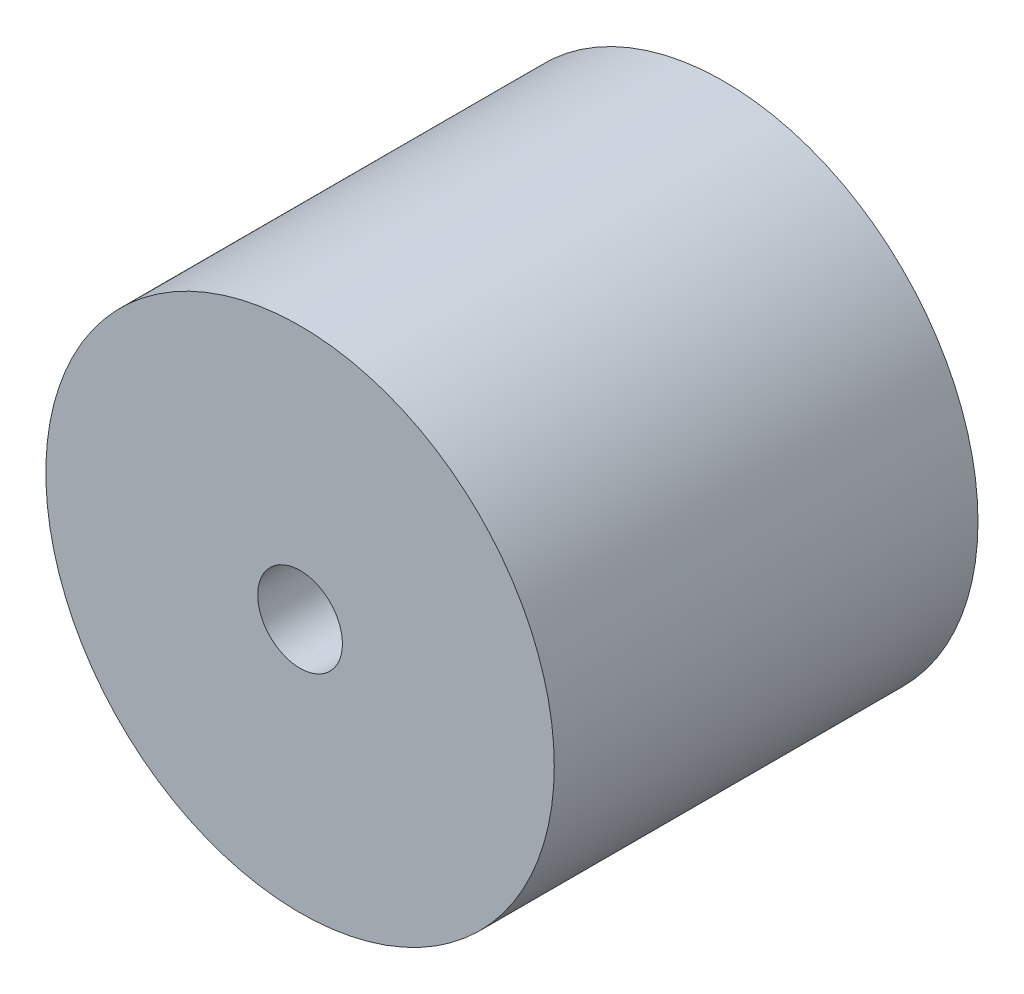
ISO-10303-21;
HEADER;
FILE_DESCRIPTION(('STEP AP214'),'2;1');
FILE_NAME('part.step','',(''),(''),'','','');
FILE_SCHEMA(('AUTOMOTIVE_DESIGN { 1 0 10303 214 1 1 1 1 }'));
ENDSEC;
DATA;
#1=APPLICATION_CONTEXT('core data for automotive mechanical design processes');
#2=APPLICATION_PROTOCOL_DEFINITION('international standard','automotive_design',2000,#1);
#3=PRODUCT_CONTEXT('',#1,'mechanical');
#4=PRODUCT('Part','Part','',(#3));
#5=PRODUCT_RELATED_PRODUCT_CATEGORY('part','',(#4));
#6=PRODUCT_DEFINITION_FORMATION('','',#4);
#7=PRODUCT_DEFINITION_CONTEXT('part definition',#1,'design');
#8=PRODUCT_DEFINITION('design','',#6,#7);
#9=PRODUCT_DEFINITION_SHAPE('','',#8);
#10=(LENGTH_UNIT() NAMED_UNIT(*) SI_UNIT(.MILLI.,.METRE.));
#11=(NAMED_UNIT(*) PLANE_ANGLE_UNIT() SI_UNIT($,.RADIAN.));
#12=(NAMED_UNIT(*) SI_UNIT($,.STERADIAN.) SOLID_ANGLE_UNIT());
#13=UNCERTAINTY_MEASURE_WITH_UNIT(LENGTH_MEASURE(1.E-05),#10,'distance_accuracy_value','');
#14=(GEOMETRIC_REPRESENTATION_CONTEXT(3) GLOBAL_UNCERTAINTY_ASSIGNED_CONTEXT((#13)) GLOBAL_UNIT_ASSIGNED_CONTEXT((#10,
#11,#12)) REPRESENTATION_CONTEXT('',''));
#15=CARTESIAN_POINT('',(0.,0.,0.));
#16=DIRECTION('',(0.,0.,1.));
#17=DIRECTION('',(1.,0.,0.));
#18=AXIS2_PLACEMENT_3D('',#15,#16,#17);
#19=CARTESIAN_POINT('',(0.,0.,30.));
#20=DIRECTION('',(0.,0.,-1.));
#21=DIRECTION('',(-1.,0.,0.));
#22=AXIS2_PLACEMENT_3D('',#19,#20,#21);
#23=CYLINDRICAL_SURFACE('',#22,18.);
#24=CARTESIAN_POINT('',(0.,0.,30.));
#25=DIRECTION('',(0.,0.,1.));
#26=DIRECTION('',(1.,0.,0.));
#27=AXIS2_PLACEMENT_3D('',#24,#25,#26);
#28=CIRCLE('',#27,18.);
#29=CARTESIAN_POINT('',(18.,0.,30.));
#30=VERTEX_POINT('',#29);
#31=EDGE_CURVE('E10',#30,#30,#28,.T.);
#32=ORIENTED_EDGE('',*,*,#31,.F.);
#33=EDGE_LOOP('',(#32));
#34=FACE_BOUND('',#33,.T.);
#35=CARTESIAN_POINT('',(0.,0.,0.));
#36=DIRECTION('',(0.,0.,1.));
#37=DIRECTION('',(1.,0.,0.));
#38=AXIS2_PLACEMENT_3D('',#35,#36,#37);
#39=CIRCLE('',#38,18.);
#40=CARTESIAN_POINT('',(18.,0.,0.));
#41=VERTEX_POINT('',#40);
#42=EDGE_CURVE('E40',#41,#41,#39,.T.);
#43=ORIENTED_EDGE('',*,*,#42,.T.);
#44=EDGE_LOOP('',(#43));
#45=FACE_BOUND('',#44,.T.);
#46=ADVANCED_FACE('F37',(#34,#45),#23,.T.);
#47=CARTESIAN_POINT('',(0.,0.,30.));
#48=DIRECTION('',(0.,0.,1.));
#49=DIRECTION('',(1.,0.,0.));
#50=AXIS2_PLACEMENT_3D('',#47,#48,#49);
#51=PLANE('',#50);
#52=CARTESIAN_POINT('',(0.,0.,30.));
#53=DIRECTION('',(0.,0.,1.));
#54=DIRECTION('',(1.,0.,0.));
#55=AXIS2_PLACEMENT_3D('',#52,#53,#54);
#56=CIRCLE('',#55,3.);
#57=CARTESIAN_POINT('',(3.,0.,30.));
#58=VERTEX_POINT('',#57);
#59=EDGE_CURVE('E51',#58,#58,#56,.T.);
#60=ORIENTED_EDGE('',*,*,#59,.F.);
#61=EDGE_LOOP('',(#60));
#62=FACE_BOUND('',#61,.T.);
#63=ORIENTED_EDGE('',*,*,#31,.T.);
#64=EDGE_LOOP('',(#63));
#65=FACE_BOUND('',#64,.T.);
#66=ADVANCED_FACE('F68',(#62,#65),#51,.T.);
#67=CARTESIAN_POINT('',(0.,0.,0.));
#68=DIRECTION('',(0.,0.,1.));
#69=DIRECTION('',(1.,0.,0.));
#70=AXIS2_PLACEMENT_3D('',#67,#68,#69);
#71=PLANE('',#70);
#72=CARTESIAN_POINT('',(0.,0.,0.));
#73=DIRECTION('',(0.,0.,1.));
#74=DIRECTION('',(1.,0.,0.));
#75=AXIS2_PLACEMENT_3D('',#72,#73,#74);
#76=CIRCLE('',#75,3.);
#77=CARTESIAN_POINT('',(3.,0.,0.));
#78=VERTEX_POINT('',#77);
#79=EDGE_CURVE('E49',#78,#78,#76,.T.);
#80=ORIENTED_EDGE('',*,*,#79,.T.);
#81=EDGE_LOOP('',(#80));
#82=FACE_BOUND('',#81,.T.);
#83=ORIENTED_EDGE('',*,*,#42,.F.);
#84=EDGE_LOOP('',(#83));
#85=FACE_BOUND('',#84,.T.);
#86=ADVANCED_FACE('F59',(#82,#85),#71,.F.);
#87=CARTESIAN_POINT('',(0.,0.,0.));
#88=DIRECTION('',(0.,0.,1.));
#89=DIRECTION('',(1.,0.,0.));
#90=AXIS2_PLACEMENT_3D('',#87,#88,#89);
#91=CYLINDRICAL_SURFACE('',#90,3.);
#92=ORIENTED_EDGE('',*,*,#79,.F.);
#93=EDGE_LOOP('',(#92));
#94=FACE_BOUND('',#93,.T.);
#95=ORIENTED_EDGE('',*,*,#59,.T.);
#96=EDGE_LOOP('',(#95));
#97=FACE_BOUND('',#96,.T.);
#98=ADVANCED_FACE('F62',(#94,#97),#91,.F.);
#99=CLOSED_SHELL('',(#46,#66,#86,#98));
#100=MANIFOLD_SOLID_BREP('B2',#99);
#101=ADVANCED_BREP_SHAPE_REPRESENTATION('',(#18,#100),#14);
#102=SHAPE_DEFINITION_REPRESENTATION(#9,#101);
ENDSEC;
END-ISO-10303-21;
